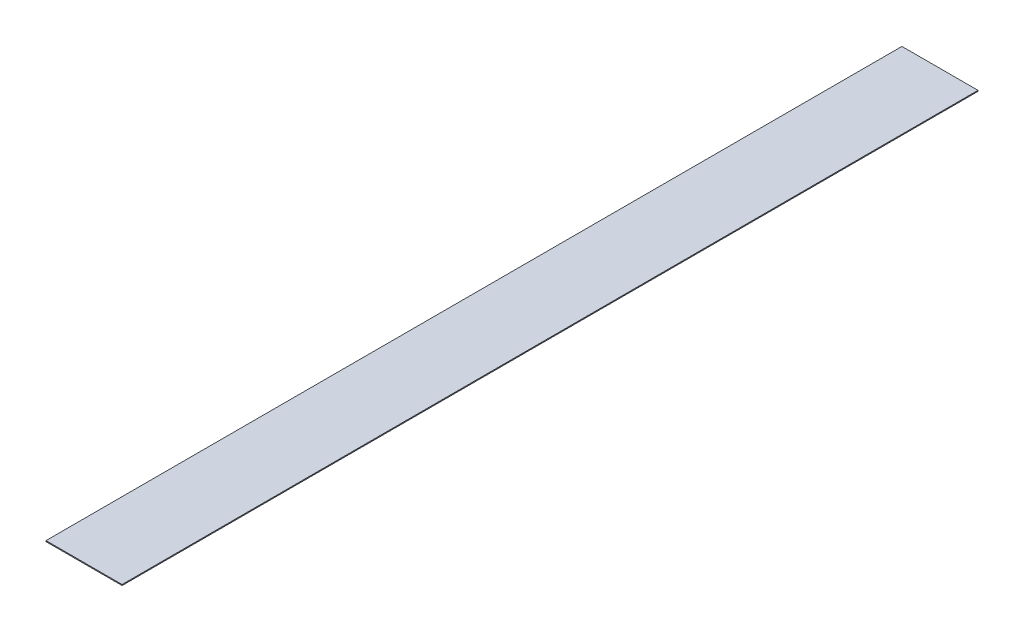
ISO-10303-21;
HEADER;
FILE_DESCRIPTION(('STEP AP214'),'2;1');
FILE_NAME('part.step','',(''),(''),'','','');
FILE_SCHEMA(('AUTOMOTIVE_DESIGN { 1 0 10303 214 1 1 1 1 }'));
ENDSEC;
DATA;
#1=APPLICATION_CONTEXT('core data for automotive mechanical design processes');
#2=APPLICATION_PROTOCOL_DEFINITION('international standard','automotive_design',2000,#1);
#3=PRODUCT_CONTEXT('',#1,'mechanical');
#4=PRODUCT('Part','Part','',(#3));
#5=PRODUCT_RELATED_PRODUCT_CATEGORY('part','',(#4));
#6=PRODUCT_DEFINITION_FORMATION('','',#4);
#7=PRODUCT_DEFINITION_CONTEXT('part definition',#1,'design');
#8=PRODUCT_DEFINITION('design','',#6,#7);
#9=PRODUCT_DEFINITION_SHAPE('','',#8);
#10=(LENGTH_UNIT() NAMED_UNIT(*) SI_UNIT(.MILLI.,.METRE.));
#11=(NAMED_UNIT(*) PLANE_ANGLE_UNIT() SI_UNIT($,.RADIAN.));
#12=(NAMED_UNIT(*) SI_UNIT($,.STERADIAN.) SOLID_ANGLE_UNIT());
#13=UNCERTAINTY_MEASURE_WITH_UNIT(LENGTH_MEASURE(1.E-05),#10,'distance_accuracy_value','');
#14=(GEOMETRIC_REPRESENTATION_CONTEXT(3) GLOBAL_UNCERTAINTY_ASSIGNED_CONTEXT((#13)) GLOBAL_UNIT_ASSIGNED_CONTEXT((#10,
#11,#12)) REPRESENTATION_CONTEXT('',''));
#15=CARTESIAN_POINT('',(0.,0.,0.));
#16=DIRECTION('',(0.,0.,1.));
#17=DIRECTION('',(1.,0.,0.));
#18=AXIS2_PLACEMENT_3D('',#15,#16,#17);
#19=CARTESIAN_POINT('',(2.,0.025,22.5));
#20=DIRECTION('',(0.,0.,-1.));
#21=DIRECTION('',(-1.,0.,0.));
#22=AXIS2_PLACEMENT_3D('',#19,#20,#21);
#23=PLANE('',#22);
#24=DIRECTION('',(1.,0.,0.));
#25=VECTOR('',#24,1.);
#26=CARTESIAN_POINT('',(2.,-0.025,22.5));
#27=LINE('',#26,#25);
#28=CARTESIAN_POINT('',(-2.,-0.025,22.5));
#29=VERTEX_POINT('',#28);
#30=CARTESIAN_POINT('',(2.,-0.025,22.5));
#31=VERTEX_POINT('',#30);
#32=EDGE_CURVE('E107',#29,#31,#27,.T.);
#33=ORIENTED_EDGE('',*,*,#32,.T.);
#34=DIRECTION('',(0.,-1.,0.));
#35=VECTOR('',#34,1.);
#36=CARTESIAN_POINT('',(2.,0.025,22.5));
#37=LINE('',#36,#35);
#38=CARTESIAN_POINT('',(2.,0.025,22.5));
#39=VERTEX_POINT('',#38);
#40=EDGE_CURVE('E11',#39,#31,#37,.T.);
#41=ORIENTED_EDGE('',*,*,#40,.F.);
#42=DIRECTION('',(1.,0.,0.));
#43=VECTOR('',#42,1.);
#44=CARTESIAN_POINT('',(2.,0.025,22.5));
#45=LINE('',#44,#43);
#46=CARTESIAN_POINT('',(-2.,0.025,22.5));
#47=VERTEX_POINT('',#46);
#48=EDGE_CURVE('E91',#47,#39,#45,.T.);
#49=ORIENTED_EDGE('',*,*,#48,.F.);
#50=DIRECTION('',(0.,-1.,0.));
#51=VECTOR('',#50,1.);
#52=CARTESIAN_POINT('',(-2.,0.025,22.5));
#53=LINE('',#52,#51);
#54=EDGE_CURVE('E103',#47,#29,#53,.T.);
#55=ORIENTED_EDGE('',*,*,#54,.T.);
#56=EDGE_LOOP('',(#33,#41,#49,#55));
#57=FACE_BOUND('',#56,.T.);
#58=ADVANCED_FACE('F39',(#57),#23,.F.);
#59=CARTESIAN_POINT('',(2.,0.025,22.5));
#60=DIRECTION('',(-1.,0.,0.));
#61=DIRECTION('',(0.,0.,1.));
#62=AXIS2_PLACEMENT_3D('',#59,#60,#61);
#63=PLANE('',#62);
#64=DIRECTION('',(0.,0.,-1.));
#65=VECTOR('',#64,1.);
#66=CARTESIAN_POINT('',(2.,-0.025,22.5));
#67=LINE('',#66,#65);
#68=CARTESIAN_POINT('',(2.,-0.025,-22.5));
#69=VERTEX_POINT('',#68);
#70=EDGE_CURVE('E96',#31,#69,#67,.T.);
#71=ORIENTED_EDGE('',*,*,#70,.T.);
#72=DIRECTION('',(0.,-1.,0.));
#73=VECTOR('',#72,1.);
#74=CARTESIAN_POINT('',(2.,0.025,-22.5));
#75=LINE('',#74,#73);
#76=CARTESIAN_POINT('',(2.,0.025,-22.5));
#77=VERTEX_POINT('',#76);
#78=EDGE_CURVE('E48',#77,#69,#75,.T.);
#79=ORIENTED_EDGE('',*,*,#78,.F.);
#80=DIRECTION('',(0.,0.,-1.));
#81=VECTOR('',#80,1.);
#82=CARTESIAN_POINT('',(2.,0.025,22.5));
#83=LINE('',#82,#81);
#84=EDGE_CURVE('E86',#39,#77,#83,.T.);
#85=ORIENTED_EDGE('',*,*,#84,.F.);
#86=ORIENTED_EDGE('',*,*,#40,.T.);
#87=EDGE_LOOP('',(#71,#79,#85,#86));
#88=FACE_BOUND('',#87,.T.);
#89=ADVANCED_FACE('F95',(#88),#63,.F.);
#90=CARTESIAN_POINT('',(2.,0.025,-22.5));
#91=DIRECTION('',(0.,0.,1.));
#92=DIRECTION('',(1.,0.,0.));
#93=AXIS2_PLACEMENT_3D('',#90,#91,#92);
#94=PLANE('',#93);
#95=DIRECTION('',(-1.,0.,0.));
#96=VECTOR('',#95,1.);
#97=CARTESIAN_POINT('',(2.,-0.025,-22.5));
#98=LINE('',#97,#96);
#99=CARTESIAN_POINT('',(-2.,-0.025,-22.5));
#100=VERTEX_POINT('',#99);
#101=EDGE_CURVE('E73',#69,#100,#98,.T.);
#102=ORIENTED_EDGE('',*,*,#101,.T.);
#103=DIRECTION('',(0.,-1.,0.));
#104=VECTOR('',#103,1.);
#105=CARTESIAN_POINT('',(-2.,0.025,-22.5));
#106=LINE('',#105,#104);
#107=CARTESIAN_POINT('',(-2.,0.025,-22.5));
#108=VERTEX_POINT('',#107);
#109=EDGE_CURVE('E98',#108,#100,#106,.T.);
#110=ORIENTED_EDGE('',*,*,#109,.F.);
#111=DIRECTION('',(-1.,0.,0.));
#112=VECTOR('',#111,1.);
#113=CARTESIAN_POINT('',(2.,0.025,-22.5));
#114=LINE('',#113,#112);
#115=EDGE_CURVE('E89',#77,#108,#114,.T.);
#116=ORIENTED_EDGE('',*,*,#115,.F.);
#117=ORIENTED_EDGE('',*,*,#78,.T.);
#118=EDGE_LOOP('',(#102,#110,#116,#117));
#119=FACE_BOUND('',#118,.T.);
#120=ADVANCED_FACE('F99',(#119),#94,.F.);
#121=CARTESIAN_POINT('',(-2.,0.025,22.5));
#122=DIRECTION('',(1.,0.,0.));
#123=DIRECTION('',(0.,0.,-1.));
#124=AXIS2_PLACEMENT_3D('',#121,#122,#123);
#125=PLANE('',#124);
#126=DIRECTION('',(0.,0.,1.));
#127=VECTOR('',#126,1.);
#128=CARTESIAN_POINT('',(-2.,-0.025,22.5));
#129=LINE('',#128,#127);
#130=EDGE_CURVE('E79',#100,#29,#129,.T.);
#131=ORIENTED_EDGE('',*,*,#130,.T.);
#132=ORIENTED_EDGE('',*,*,#54,.F.);
#133=DIRECTION('',(0.,0.,1.));
#134=VECTOR('',#133,1.);
#135=CARTESIAN_POINT('',(-2.,0.025,22.5));
#136=LINE('',#135,#134);
#137=EDGE_CURVE('E56',#108,#47,#136,.T.);
#138=ORIENTED_EDGE('',*,*,#137,.F.);
#139=ORIENTED_EDGE('',*,*,#109,.T.);
#140=EDGE_LOOP('',(#131,#132,#138,#139));
#141=FACE_BOUND('',#140,.T.);
#142=ADVANCED_FACE('F120',(#141),#125,.F.);
#143=CARTESIAN_POINT('',(0.,0.025,0.));
#144=DIRECTION('',(0.,-1.,0.));
#145=DIRECTION('',(0.,0.,-1.));
#146=AXIS2_PLACEMENT_3D('',#143,#144,#145);
#147=PLANE('',#146);
#148=ORIENTED_EDGE('',*,*,#48,.T.);
#149=ORIENTED_EDGE('',*,*,#84,.T.);
#150=ORIENTED_EDGE('',*,*,#115,.T.);
#151=ORIENTED_EDGE('',*,*,#137,.T.);
#152=EDGE_LOOP('',(#148,#149,#150,#151));
#153=FACE_BOUND('',#152,.T.);
#154=ADVANCED_FACE('F87',(#153),#147,.F.);
#155=CARTESIAN_POINT('',(0.,-0.025,0.));
#156=DIRECTION('',(0.,-1.,0.));
#157=DIRECTION('',(0.,0.,-1.));
#158=AXIS2_PLACEMENT_3D('',#155,#156,#157);
#159=PLANE('',#158);
#160=ORIENTED_EDGE('',*,*,#32,.F.);
#161=ORIENTED_EDGE('',*,*,#130,.F.);
#162=ORIENTED_EDGE('',*,*,#101,.F.);
#163=ORIENTED_EDGE('',*,*,#70,.F.);
#164=EDGE_LOOP('',(#160,#161,#162,#163));
#165=FACE_BOUND('',#164,.T.);
#166=ADVANCED_FACE('F123',(#165),#159,.T.);
#167=CLOSED_SHELL('',(#58,#89,#120,#142,#154,#166));
#168=MANIFOLD_SOLID_BREP('B2',#167);
#169=ADVANCED_BREP_SHAPE_REPRESENTATION('',(#18,#168),#14);
#170=SHAPE_DEFINITION_REPRESENTATION(#9,#169);
ENDSEC;
END-ISO-10303-21;
